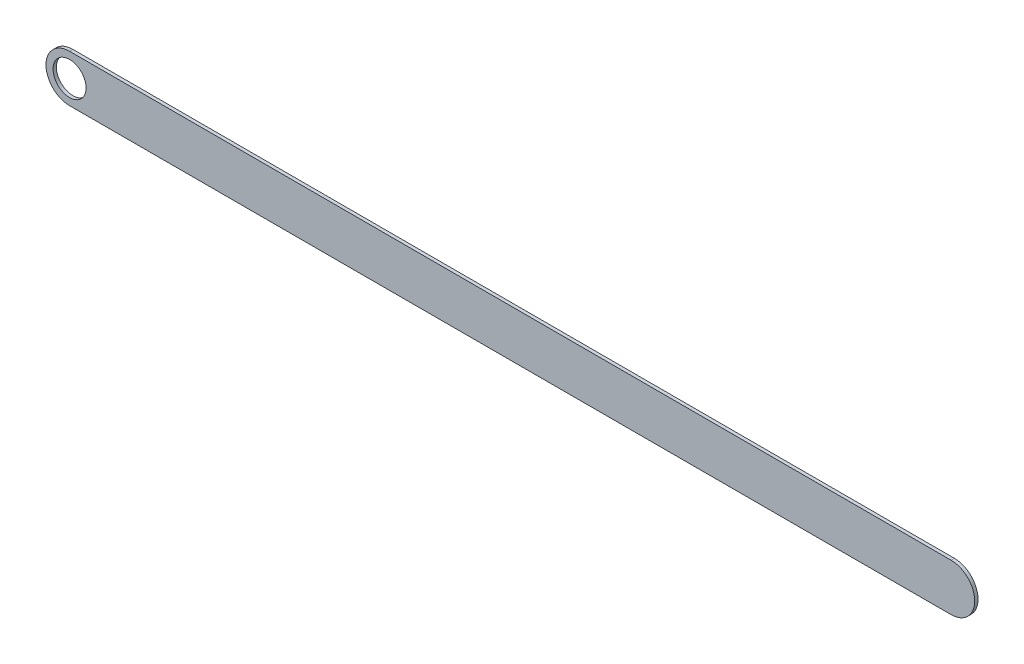
ISO-10303-21;
HEADER;
FILE_DESCRIPTION(('STEP AP214'),'2;1');
FILE_NAME('part.step','',(''),(''),'','','');
FILE_SCHEMA(('AUTOMOTIVE_DESIGN { 1 0 10303 214 1 1 1 1 }'));
ENDSEC;
DATA;
#1=APPLICATION_CONTEXT('core data for automotive mechanical design processes');
#2=APPLICATION_PROTOCOL_DEFINITION('international standard','automotive_design',2000,#1);
#3=PRODUCT_CONTEXT('',#1,'mechanical');
#4=PRODUCT('Part','Part','',(#3));
#5=PRODUCT_RELATED_PRODUCT_CATEGORY('part','',(#4));
#6=PRODUCT_DEFINITION_FORMATION('','',#4);
#7=PRODUCT_DEFINITION_CONTEXT('part definition',#1,'design');
#8=PRODUCT_DEFINITION('design','',#6,#7);
#9=PRODUCT_DEFINITION_SHAPE('','',#8);
#10=(LENGTH_UNIT() NAMED_UNIT(*) SI_UNIT(.MILLI.,.METRE.));
#11=(NAMED_UNIT(*) PLANE_ANGLE_UNIT() SI_UNIT($,.RADIAN.));
#12=(NAMED_UNIT(*) SI_UNIT($,.STERADIAN.) SOLID_ANGLE_UNIT());
#13=UNCERTAINTY_MEASURE_WITH_UNIT(LENGTH_MEASURE(1.E-05),#10,'distance_accuracy_value','');
#14=(GEOMETRIC_REPRESENTATION_CONTEXT(3) GLOBAL_UNCERTAINTY_ASSIGNED_CONTEXT((#13)) GLOBAL_UNIT_ASSIGNED_CONTEXT((#10,
#11,#12)) REPRESENTATION_CONTEXT('',''));
#15=CARTESIAN_POINT('',(0.,0.,0.));
#16=DIRECTION('',(0.,0.,1.));
#17=DIRECTION('',(1.,0.,0.));
#18=AXIS2_PLACEMENT_3D('',#15,#16,#17);
#19=CARTESIAN_POINT('',(97.66,-96.26,-0.045));
#20=DIRECTION('',(0.,0.,-1.));
#21=DIRECTION('',(0.,-1.,0.));
#22=AXIS2_PLACEMENT_3D('',#19,#20,#21);
#23=CYLINDRICAL_SURFACE('',#22,0.175);
#24=CARTESIAN_POINT('',(97.66,-96.26,1.6));
#25=DIRECTION('',(0.,0.,-1.));
#26=DIRECTION('',(0.,-1.,0.));
#27=AXIS2_PLACEMENT_3D('',#24,#25,#26);
#28=CIRCLE('',#27,0.175);
#29=CARTESIAN_POINT('',(97.66,-96.435,1.6));
#30=VERTEX_POINT('',#29);
#31=EDGE_CURVE('E120',#30,#30,#28,.T.);
#32=ORIENTED_EDGE('',*,*,#31,.T.);
#33=DIRECTION('',(0.,0.,1.));
#34=VECTOR('',#33,1.);
#35=CARTESIAN_POINT('',(97.66,-96.435,-0.045));
#36=LINE('',#35,#34);
#37=CARTESIAN_POINT('',(97.66,-96.435,1.635));
#38=VERTEX_POINT('',#37);
#39=EDGE_CURVE('E11',#30,#38,#36,.T.);
#40=ORIENTED_EDGE('',*,*,#39,.T.);
#41=CARTESIAN_POINT('',(97.66,-96.26,1.635));
#42=DIRECTION('',(0.,0.,-1.));
#43=DIRECTION('',(0.,-1.,0.));
#44=AXIS2_PLACEMENT_3D('',#41,#42,#43);
#45=CIRCLE('',#44,0.175);
#46=EDGE_CURVE('E20',#38,#38,#45,.T.);
#47=ORIENTED_EDGE('',*,*,#46,.F.);
#48=ORIENTED_EDGE('',*,*,#39,.F.);
#49=EDGE_LOOP('',(#32,#40,#47,#48));
#50=FACE_BOUND('',#49,.T.);
#51=ADVANCED_FACE('F17',(#50),#23,.F.);
#52=CARTESIAN_POINT('',(107.01,-96.01,1.6));
#53=DIRECTION('',(0.,-1.,0.));
#54=DIRECTION('',(0.,0.,-1.));
#55=AXIS2_PLACEMENT_3D('',#52,#53,#54);
#56=PLANE('',#55);
#57=DIRECTION('',(-1.,0.,0.));
#58=VECTOR('',#57,1.);
#59=CARTESIAN_POINT('',(107.01,-96.01,1.6));
#60=LINE('',#59,#58);
#61=CARTESIAN_POINT('',(107.01,-96.01,1.6));
#62=VERTEX_POINT('',#61);
#63=CARTESIAN_POINT('',(97.66,-96.01,1.6));
#64=VERTEX_POINT('',#63);
#65=EDGE_CURVE('E122',#62,#64,#60,.T.);
#66=ORIENTED_EDGE('',*,*,#65,.T.);
#67=DIRECTION('',(0.,0.,1.));
#68=VECTOR('',#67,1.);
#69=CARTESIAN_POINT('',(97.66,-96.01,1.6));
#70=LINE('',#69,#68);
#71=CARTESIAN_POINT('',(97.66,-96.01,1.635));
#72=VERTEX_POINT('',#71);
#73=EDGE_CURVE('E84',#64,#72,#70,.T.);
#74=ORIENTED_EDGE('',*,*,#73,.T.);
#75=DIRECTION('',(-1.,0.,0.));
#76=VECTOR('',#75,1.);
#77=CARTESIAN_POINT('',(107.01,-96.01,1.635));
#78=LINE('',#77,#76);
#79=CARTESIAN_POINT('',(107.01,-96.01,1.635));
#80=VERTEX_POINT('',#79);
#81=EDGE_CURVE('E118',#80,#72,#78,.T.);
#82=ORIENTED_EDGE('',*,*,#81,.F.);
#83=DIRECTION('',(0.,0.,1.));
#84=VECTOR('',#83,1.);
#85=CARTESIAN_POINT('',(107.01,-96.01,1.6));
#86=LINE('',#85,#84);
#87=EDGE_CURVE('E115',#62,#80,#86,.T.);
#88=ORIENTED_EDGE('',*,*,#87,.F.);
#89=EDGE_LOOP('',(#66,#74,#82,#88));
#90=FACE_BOUND('',#89,.T.);
#91=ADVANCED_FACE('F150',(#90),#56,.F.);
#92=CARTESIAN_POINT('',(97.66,-96.51,1.635));
#93=DIRECTION('',(0.,0.,1.));
#94=DIRECTION('',(1.,0.,0.));
#95=AXIS2_PLACEMENT_3D('',#92,#93,#94);
#96=PLANE('',#95);
#97=ORIENTED_EDGE('',*,*,#46,.T.);
#98=EDGE_LOOP('',(#97));
#99=FACE_BOUND('',#98,.T.);
#100=DIRECTION('',(1.,0.,0.));
#101=VECTOR('',#100,1.);
#102=CARTESIAN_POINT('',(97.66,-96.51,1.635));
#103=LINE('',#102,#101);
#104=CARTESIAN_POINT('',(97.66,-96.51,1.635));
#105=VERTEX_POINT('',#104);
#106=CARTESIAN_POINT('',(107.01,-96.51,1.635));
#107=VERTEX_POINT('',#106);
#108=EDGE_CURVE('E96',#105,#107,#103,.T.);
#109=ORIENTED_EDGE('',*,*,#108,.T.);
#110=CARTESIAN_POINT('',(107.01,-96.26,1.635));
#111=DIRECTION('',(0.,0.,1.));
#112=DIRECTION('',(0.,-1.,0.));
#113=AXIS2_PLACEMENT_3D('',#110,#111,#112);
#114=CIRCLE('',#113,0.25);
#115=EDGE_CURVE('E125',#107,#80,#114,.T.);
#116=ORIENTED_EDGE('',*,*,#115,.T.);
#117=ORIENTED_EDGE('',*,*,#81,.T.);
#118=CARTESIAN_POINT('',(97.66,-96.26,1.635));
#119=DIRECTION('',(0.,0.,1.));
#120=DIRECTION('',(0.,1.,0.));
#121=AXIS2_PLACEMENT_3D('',#118,#119,#120);
#122=CIRCLE('',#121,0.25);
#123=EDGE_CURVE('E88',#72,#105,#122,.T.);
#124=ORIENTED_EDGE('',*,*,#123,.T.);
#125=EDGE_LOOP('',(#109,#116,#117,#124));
#126=FACE_BOUND('',#125,.T.);
#127=ADVANCED_FACE('F140',(#99,#126),#96,.T.);
#128=CARTESIAN_POINT('',(97.66,-96.51,1.6));
#129=DIRECTION('',(0.,0.,1.));
#130=DIRECTION('',(1.,0.,0.));
#131=AXIS2_PLACEMENT_3D('',#128,#129,#130);
#132=PLANE('',#131);
#133=ORIENTED_EDGE('',*,*,#31,.F.);
#134=EDGE_LOOP('',(#133));
#135=FACE_BOUND('',#134,.T.);
#136=CARTESIAN_POINT('',(97.66,-96.26,1.6));
#137=DIRECTION('',(0.,0.,1.));
#138=DIRECTION('',(0.,1.,0.));
#139=AXIS2_PLACEMENT_3D('',#136,#137,#138);
#140=CIRCLE('',#139,0.25);
#141=CARTESIAN_POINT('',(97.66,-96.51,1.6));
#142=VERTEX_POINT('',#141);
#143=EDGE_CURVE('E77',#64,#142,#140,.T.);
#144=ORIENTED_EDGE('',*,*,#143,.F.);
#145=ORIENTED_EDGE('',*,*,#65,.F.);
#146=CARTESIAN_POINT('',(107.01,-96.26,1.6));
#147=DIRECTION('',(0.,0.,1.));
#148=DIRECTION('',(0.,-1.,0.));
#149=AXIS2_PLACEMENT_3D('',#146,#147,#148);
#150=CIRCLE('',#149,0.25);
#151=CARTESIAN_POINT('',(107.01,-96.51,1.6));
#152=VERTEX_POINT('',#151);
#153=EDGE_CURVE('E101',#152,#62,#150,.T.);
#154=ORIENTED_EDGE('',*,*,#153,.F.);
#155=DIRECTION('',(1.,0.,0.));
#156=VECTOR('',#155,1.);
#157=CARTESIAN_POINT('',(97.66,-96.51,1.6));
#158=LINE('',#157,#156);
#159=EDGE_CURVE('E94',#142,#152,#158,.T.);
#160=ORIENTED_EDGE('',*,*,#159,.F.);
#161=EDGE_LOOP('',(#144,#145,#154,#160));
#162=FACE_BOUND('',#161,.T.);
#163=ADVANCED_FACE('F99',(#135,#162),#132,.F.);
#164=CARTESIAN_POINT('',(107.01,-96.26,1.6));
#165=DIRECTION('',(0.,0.,-1.));
#166=DIRECTION('',(0.,-1.,0.));
#167=AXIS2_PLACEMENT_3D('',#164,#165,#166);
#168=CYLINDRICAL_SURFACE('',#167,0.25);
#169=ORIENTED_EDGE('',*,*,#153,.T.);
#170=ORIENTED_EDGE('',*,*,#87,.T.);
#171=ORIENTED_EDGE('',*,*,#115,.F.);
#172=DIRECTION('',(0.,0.,1.));
#173=VECTOR('',#172,1.);
#174=CARTESIAN_POINT('',(107.01,-96.51,1.6));
#175=LINE('',#174,#173);
#176=EDGE_CURVE('E104',#152,#107,#175,.T.);
#177=ORIENTED_EDGE('',*,*,#176,.F.);
#178=EDGE_LOOP('',(#169,#170,#171,#177));
#179=FACE_BOUND('',#178,.T.);
#180=ADVANCED_FACE('F139',(#179),#168,.T.);
#181=CARTESIAN_POINT('',(97.66,-96.26,1.6));
#182=DIRECTION('',(0.,0.,-1.));
#183=DIRECTION('',(0.,1.,0.));
#184=AXIS2_PLACEMENT_3D('',#181,#182,#183);
#185=CYLINDRICAL_SURFACE('',#184,0.25);
#186=ORIENTED_EDGE('',*,*,#143,.T.);
#187=DIRECTION('',(0.,0.,1.));
#188=VECTOR('',#187,1.);
#189=CARTESIAN_POINT('',(97.66,-96.51,1.6));
#190=LINE('',#189,#188);
#191=EDGE_CURVE('E81',#142,#105,#190,.T.);
#192=ORIENTED_EDGE('',*,*,#191,.T.);
#193=ORIENTED_EDGE('',*,*,#123,.F.);
#194=ORIENTED_EDGE('',*,*,#73,.F.);
#195=EDGE_LOOP('',(#186,#192,#193,#194));
#196=FACE_BOUND('',#195,.T.);
#197=ADVANCED_FACE('F79',(#196),#185,.T.);
#198=CARTESIAN_POINT('',(97.66,-96.51,1.6));
#199=DIRECTION('',(0.,1.,0.));
#200=DIRECTION('',(1.,0.,0.));
#201=AXIS2_PLACEMENT_3D('',#198,#199,#200);
#202=PLANE('',#201);
#203=ORIENTED_EDGE('',*,*,#159,.T.);
#204=ORIENTED_EDGE('',*,*,#176,.T.);
#205=ORIENTED_EDGE('',*,*,#108,.F.);
#206=ORIENTED_EDGE('',*,*,#191,.F.);
#207=EDGE_LOOP('',(#203,#204,#205,#206));
#208=FACE_BOUND('',#207,.T.);
#209=ADVANCED_FACE('F92',(#208),#202,.F.);
#210=CLOSED_SHELL('',(#51,#91,#127,#163,#180,#197,#209));
#211=MANIFOLD_SOLID_BREP('B1',#210);
#212=ADVANCED_BREP_SHAPE_REPRESENTATION('',(#18,#211),#14);
#213=SHAPE_DEFINITION_REPRESENTATION(#9,#212);
ENDSEC;
END-ISO-10303-21;
